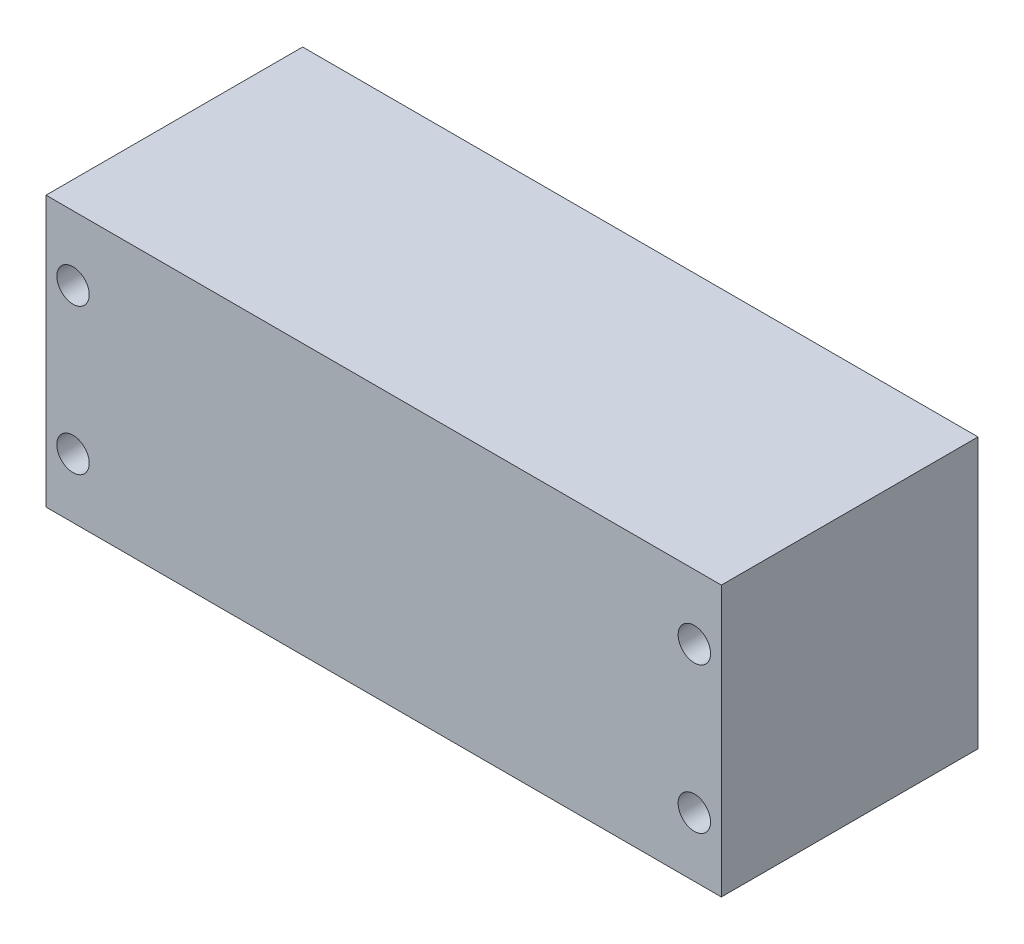
ISO-10303-21;
HEADER;
FILE_DESCRIPTION(('STEP AP214'),'2;1');
FILE_NAME('part.step','',(''),(''),'','','');
FILE_SCHEMA(('AUTOMOTIVE_DESIGN { 1 0 10303 214 1 1 1 1 }'));
ENDSEC;
DATA;
#1=APPLICATION_CONTEXT('core data for automotive mechanical design processes');
#2=APPLICATION_PROTOCOL_DEFINITION('international standard','automotive_design',2000,#1);
#3=PRODUCT_CONTEXT('',#1,'mechanical');
#4=PRODUCT('Part','Part','',(#3));
#5=PRODUCT_RELATED_PRODUCT_CATEGORY('part','',(#4));
#6=PRODUCT_DEFINITION_FORMATION('','',#4);
#7=PRODUCT_DEFINITION_CONTEXT('part definition',#1,'design');
#8=PRODUCT_DEFINITION('design','',#6,#7);
#9=PRODUCT_DEFINITION_SHAPE('','',#8);
#10=(LENGTH_UNIT() NAMED_UNIT(*) SI_UNIT(.MILLI.,.METRE.));
#11=(NAMED_UNIT(*) PLANE_ANGLE_UNIT() SI_UNIT($,.RADIAN.));
#12=(NAMED_UNIT(*) SI_UNIT($,.STERADIAN.) SOLID_ANGLE_UNIT());
#13=UNCERTAINTY_MEASURE_WITH_UNIT(LENGTH_MEASURE(1.E-05),#10,'distance_accuracy_value','');
#14=(GEOMETRIC_REPRESENTATION_CONTEXT(3) GLOBAL_UNCERTAINTY_ASSIGNED_CONTEXT((#13)) GLOBAL_UNIT_ASSIGNED_CONTEXT((#10,
#11,#12)) REPRESENTATION_CONTEXT('',''));
#15=CARTESIAN_POINT('',(0.,0.,0.));
#16=DIRECTION('',(0.,0.,1.));
#17=DIRECTION('',(1.,0.,0.));
#18=AXIS2_PLACEMENT_3D('',#15,#16,#17);
#19=CARTESIAN_POINT('',(-33.75,21.5625,38.));
#20=DIRECTION('',(1.,0.,0.));
#21=DIRECTION('',(0.,0.,-1.));
#22=AXIS2_PLACEMENT_3D('',#19,#20,#21);
#23=PLANE('',#22);
#24=DIRECTION('',(0.,-1.,0.));
#25=VECTOR('',#24,1.);
#26=CARTESIAN_POINT('',(-33.75,21.5625,0.));
#27=LINE('',#26,#25);
#28=CARTESIAN_POINT('',(-33.75,21.5625,0.));
#29=VERTEX_POINT('',#28);
#30=CARTESIAN_POINT('',(-33.75,-18.4375,0.));
#31=VERTEX_POINT('',#30);
#32=EDGE_CURVE('E226',#29,#31,#27,.T.);
#33=ORIENTED_EDGE('',*,*,#32,.T.);
#34=DIRECTION('',(0.,0.,-1.));
#35=VECTOR('',#34,1.);
#36=CARTESIAN_POINT('',(-33.75,-18.4375,38.));
#37=LINE('',#36,#35);
#38=CARTESIAN_POINT('',(-33.75,-18.4375,38.));
#39=VERTEX_POINT('',#38);
#40=EDGE_CURVE('E11',#39,#31,#37,.T.);
#41=ORIENTED_EDGE('',*,*,#40,.F.);
#42=DIRECTION('',(0.,-1.,0.));
#43=VECTOR('',#42,1.);
#44=CARTESIAN_POINT('',(-33.75,21.5625,38.));
#45=LINE('',#44,#43);
#46=CARTESIAN_POINT('',(-33.75,21.5625,38.));
#47=VERTEX_POINT('',#46);
#48=EDGE_CURVE('E262',#47,#39,#45,.T.);
#49=ORIENTED_EDGE('',*,*,#48,.F.);
#50=DIRECTION('',(0.,0.,-1.));
#51=VECTOR('',#50,1.);
#52=CARTESIAN_POINT('',(-33.75,21.5625,38.));
#53=LINE('',#52,#51);
#54=EDGE_CURVE('E268',#47,#29,#53,.T.);
#55=ORIENTED_EDGE('',*,*,#54,.T.);
#56=EDGE_LOOP('',(#33,#41,#49,#55));
#57=FACE_BOUND('',#56,.T.);
#58=ADVANCED_FACE('F35',(#57),#23,.F.);
#59=CARTESIAN_POINT('',(-33.75,-18.4375,38.));
#60=DIRECTION('',(0.,1.,0.));
#61=DIRECTION('',(0.,0.,1.));
#62=AXIS2_PLACEMENT_3D('',#59,#60,#61);
#63=PLANE('',#62);
#64=DIRECTION('',(1.,0.,0.));
#65=VECTOR('',#64,1.);
#66=CARTESIAN_POINT('',(-33.75,-18.4375,0.));
#67=LINE('',#66,#65);
#68=CARTESIAN_POINT('',(66.25,-18.4375,0.));
#69=VERTEX_POINT('',#68);
#70=EDGE_CURVE('E271',#31,#69,#67,.T.);
#71=ORIENTED_EDGE('',*,*,#70,.T.);
#72=DIRECTION('',(0.,0.,-1.));
#73=VECTOR('',#72,1.);
#74=CARTESIAN_POINT('',(66.25,-18.4375,38.));
#75=LINE('',#74,#73);
#76=CARTESIAN_POINT('',(66.25,-18.4375,38.));
#77=VERTEX_POINT('',#76);
#78=EDGE_CURVE('E42',#77,#69,#75,.T.);
#79=ORIENTED_EDGE('',*,*,#78,.F.);
#80=DIRECTION('',(1.,0.,0.));
#81=VECTOR('',#80,1.);
#82=CARTESIAN_POINT('',(-33.75,-18.4375,38.));
#83=LINE('',#82,#81);
#84=EDGE_CURVE('E86',#39,#77,#83,.T.);
#85=ORIENTED_EDGE('',*,*,#84,.F.);
#86=ORIENTED_EDGE('',*,*,#40,.T.);
#87=EDGE_LOOP('',(#71,#79,#85,#86));
#88=FACE_BOUND('',#87,.T.);
#89=ADVANCED_FACE('F301',(#88),#63,.F.);
#90=CARTESIAN_POINT('',(66.25,21.5625,38.));
#91=DIRECTION('',(-1.,0.,0.));
#92=DIRECTION('',(0.,0.,1.));
#93=AXIS2_PLACEMENT_3D('',#90,#91,#92);
#94=PLANE('',#93);
#95=DIRECTION('',(0.,1.,0.));
#96=VECTOR('',#95,1.);
#97=CARTESIAN_POINT('',(66.25,21.5625,0.));
#98=LINE('',#97,#96);
#99=CARTESIAN_POINT('',(66.25,21.5625,0.));
#100=VERTEX_POINT('',#99);
#101=EDGE_CURVE('E273',#69,#100,#98,.T.);
#102=ORIENTED_EDGE('',*,*,#101,.T.);
#103=DIRECTION('',(0.,0.,-1.));
#104=VECTOR('',#103,1.);
#105=CARTESIAN_POINT('',(66.25,21.5625,38.));
#106=LINE('',#105,#104);
#107=CARTESIAN_POINT('',(66.25,21.5625,38.));
#108=VERTEX_POINT('',#107);
#109=EDGE_CURVE('E277',#108,#100,#106,.T.);
#110=ORIENTED_EDGE('',*,*,#109,.F.);
#111=DIRECTION('',(0.,1.,0.));
#112=VECTOR('',#111,1.);
#113=CARTESIAN_POINT('',(66.25,21.5625,38.));
#114=LINE('',#113,#112);
#115=EDGE_CURVE('E265',#77,#108,#114,.T.);
#116=ORIENTED_EDGE('',*,*,#115,.F.);
#117=ORIENTED_EDGE('',*,*,#78,.T.);
#118=EDGE_LOOP('',(#102,#110,#116,#117));
#119=FACE_BOUND('',#118,.T.);
#120=ADVANCED_FACE('F282',(#119),#94,.F.);
#121=CARTESIAN_POINT('',(-33.75,21.5625,38.));
#122=DIRECTION('',(0.,-1.,0.));
#123=DIRECTION('',(0.,0.,-1.));
#124=AXIS2_PLACEMENT_3D('',#121,#122,#123);
#125=PLANE('',#124);
#126=DIRECTION('',(-1.,0.,0.));
#127=VECTOR('',#126,1.);
#128=CARTESIAN_POINT('',(-33.75,21.5625,0.));
#129=LINE('',#128,#127);
#130=EDGE_CURVE('E79',#100,#29,#129,.T.);
#131=ORIENTED_EDGE('',*,*,#130,.T.);
#132=ORIENTED_EDGE('',*,*,#54,.F.);
#133=DIRECTION('',(-1.,0.,0.));
#134=VECTOR('',#133,1.);
#135=CARTESIAN_POINT('',(-33.75,21.5625,38.));
#136=LINE('',#135,#134);
#137=EDGE_CURVE('E58',#108,#47,#136,.T.);
#138=ORIENTED_EDGE('',*,*,#137,.F.);
#139=ORIENTED_EDGE('',*,*,#109,.T.);
#140=EDGE_LOOP('',(#131,#132,#138,#139));
#141=FACE_BOUND('',#140,.T.);
#142=ADVANCED_FACE('F290',(#141),#125,.F.);
#143=CARTESIAN_POINT('',(0.,0.,38.));
#144=DIRECTION('',(0.,0.,1.));
#145=DIRECTION('',(1.,0.,0.));
#146=AXIS2_PLACEMENT_3D('',#143,#144,#145);
#147=PLANE('',#146);
#148=CARTESIAN_POINT('',(62.25,-9.61656175528777,38.));
#149=DIRECTION('',(0.,0.,1.));
#150=DIRECTION('',(1.,0.,0.));
#151=AXIS2_PLACEMENT_3D('',#148,#149,#150);
#152=CIRCLE('',#151,2.4);
#153=CARTESIAN_POINT('',(64.65,-9.61656175528777,38.));
#154=VERTEX_POINT('',#153);
#155=EDGE_CURVE('E541',#154,#154,#152,.F.);
#156=ORIENTED_EDGE('',*,*,#155,.T.);
#157=EDGE_LOOP('',(#156));
#158=FACE_BOUND('',#157,.T.);
#159=CARTESIAN_POINT('',(-29.75,11.9847981896726,38.));
#160=DIRECTION('',(0.,0.,1.));
#161=DIRECTION('',(1.,0.,0.));
#162=AXIS2_PLACEMENT_3D('',#159,#160,#161);
#163=CIRCLE('',#162,2.4);
#164=CARTESIAN_POINT('',(-27.35,11.9847981896726,38.));
#165=VERTEX_POINT('',#164);
#166=EDGE_CURVE('E555',#165,#165,#163,.F.);
#167=ORIENTED_EDGE('',*,*,#166,.T.);
#168=EDGE_LOOP('',(#167));
#169=FACE_BOUND('',#168,.T.);
#170=CARTESIAN_POINT('',(-29.75,-9.61656175528777,38.));
#171=DIRECTION('',(0.,0.,1.));
#172=DIRECTION('',(1.,0.,0.));
#173=AXIS2_PLACEMENT_3D('',#170,#171,#172);
#174=CIRCLE('',#173,2.4);
#175=CARTESIAN_POINT('',(-27.35,-9.61656175528777,38.));
#176=VERTEX_POINT('',#175);
#177=EDGE_CURVE('E550',#176,#176,#174,.F.);
#178=ORIENTED_EDGE('',*,*,#177,.T.);
#179=EDGE_LOOP('',(#178));
#180=FACE_BOUND('',#179,.T.);
#181=CARTESIAN_POINT('',(62.25,11.9847981896726,38.));
#182=DIRECTION('',(0.,0.,1.));
#183=DIRECTION('',(1.,0.,0.));
#184=AXIS2_PLACEMENT_3D('',#181,#182,#183);
#185=CIRCLE('',#184,2.4);
#186=CARTESIAN_POINT('',(64.65,11.9847981896726,38.));
#187=VERTEX_POINT('',#186);
#188=EDGE_CURVE('E181',#187,#187,#185,.F.);
#189=ORIENTED_EDGE('',*,*,#188,.T.);
#190=EDGE_LOOP('',(#189));
#191=FACE_BOUND('',#190,.T.);
#192=ORIENTED_EDGE('',*,*,#48,.T.);
#193=ORIENTED_EDGE('',*,*,#84,.T.);
#194=ORIENTED_EDGE('',*,*,#115,.T.);
#195=ORIENTED_EDGE('',*,*,#137,.T.);
#196=EDGE_LOOP('',(#192,#193,#194,#195));
#197=FACE_BOUND('',#196,.T.);
#198=ADVANCED_FACE('F292',(#158,#169,#180,#191,#197),#147,.T.);
#199=CARTESIAN_POINT('',(0.,0.,0.));
#200=DIRECTION('',(0.,0.,1.));
#201=DIRECTION('',(1.,0.,0.));
#202=AXIS2_PLACEMENT_3D('',#199,#200,#201);
#203=PLANE('',#202);
#204=CARTESIAN_POINT('',(62.25,-9.61656175528777,0.));
#205=DIRECTION('',(0.,0.,-1.));
#206=DIRECTION('',(-1.,0.,0.));
#207=AXIS2_PLACEMENT_3D('',#204,#205,#206);
#208=CIRCLE('',#207,2.4);
#209=CARTESIAN_POINT('',(59.85,-9.61656175528777,0.));
#210=VERTEX_POINT('',#209);
#211=EDGE_CURVE('E544',#210,#210,#208,.T.);
#212=ORIENTED_EDGE('',*,*,#211,.F.);
#213=EDGE_LOOP('',(#212));
#214=FACE_BOUND('',#213,.T.);
#215=CARTESIAN_POINT('',(-29.75,11.9847981896726,0.));
#216=DIRECTION('',(0.,0.,-1.));
#217=DIRECTION('',(-1.,0.,0.));
#218=AXIS2_PLACEMENT_3D('',#215,#216,#217);
#219=CIRCLE('',#218,2.4);
#220=CARTESIAN_POINT('',(-32.15,11.9847981896726,0.));
#221=VERTEX_POINT('',#220);
#222=EDGE_CURVE('E547',#221,#221,#219,.T.);
#223=ORIENTED_EDGE('',*,*,#222,.F.);
#224=EDGE_LOOP('',(#223));
#225=FACE_BOUND('',#224,.T.);
#226=CARTESIAN_POINT('',(-29.75,-9.61656175528777,0.));
#227=DIRECTION('',(0.,0.,-1.));
#228=DIRECTION('',(-1.,0.,0.));
#229=AXIS2_PLACEMENT_3D('',#226,#227,#228);
#230=CIRCLE('',#229,2.4);
#231=CARTESIAN_POINT('',(-32.15,-9.61656175528777,0.));
#232=VERTEX_POINT('',#231);
#233=EDGE_CURVE('E557',#232,#232,#230,.T.);
#234=ORIENTED_EDGE('',*,*,#233,.F.);
#235=EDGE_LOOP('',(#234));
#236=FACE_BOUND('',#235,.T.);
#237=CARTESIAN_POINT('',(62.25,11.9847981896726,0.));
#238=DIRECTION('',(0.,0.,-1.));
#239=DIRECTION('',(-1.,0.,0.));
#240=AXIS2_PLACEMENT_3D('',#237,#238,#239);
#241=CIRCLE('',#240,2.4);
#242=CARTESIAN_POINT('',(59.85,11.9847981896726,0.));
#243=VERTEX_POINT('',#242);
#244=EDGE_CURVE('E188',#243,#243,#241,.T.);
#245=ORIENTED_EDGE('',*,*,#244,.F.);
#246=EDGE_LOOP('',(#245));
#247=FACE_BOUND('',#246,.T.);
#248=CARTESIAN_POINT('',(14.7943646779699,41.4869776839567,0.));
#249=DIRECTION('',(0.,0.,-1.));
#250=DIRECTION('',(-1.,0.,0.));
#251=AXIS2_PLACEMENT_3D('',#248,#249,#250);
#252=CIRCLE('',#251,58.9624815007806);
#253=CARTESIAN_POINT('',(58.2310525399103,1.61432574914989,0.));
#254=VERTEX_POINT('',#253);
#255=CARTESIAN_POINT('',(-25.078287256837,-1.94971017798371,0.));
#256=VERTEX_POINT('',#255);
#257=EDGE_CURVE('E187',#254,#256,#252,.T.);
#258=ORIENTED_EDGE('',*,*,#257,.F.);
#259=CARTESIAN_POINT('',(52.2795275247732,7.07752050663463,0.));
#260=DIRECTION('',(0.,0.,-1.));
#261=DIRECTION('',(-1.,0.,0.));
#262=AXIS2_PLACEMENT_3D('',#259,#260,#261);
#263=CIRCLE('',#262,8.07880851140879);
#264=CARTESIAN_POINT('',(46.3280025096362,12.5407152641194,0.));
#265=VERTEX_POINT('',#264);
#266=EDGE_CURVE('E49',#265,#254,#263,.T.);
#267=ORIENTED_EDGE('',*,*,#266,.F.);
#268=CARTESIAN_POINT('',(14.7943646779699,41.4869776839567,0.));
#269=DIRECTION('',(0.,0.,-1.));
#270=DIRECTION('',(-1.,0.,0.));
#271=AXIS2_PLACEMENT_3D('',#268,#269,#270);
#272=CIRCLE('',#271,42.804864477963);
#273=CARTESIAN_POINT('',(-14.1518977418674,9.95333985229037,0.));
#274=VERTEX_POINT('',#273);
#275=EDGE_CURVE('E175',#265,#274,#272,.T.);
#276=ORIENTED_EDGE('',*,*,#275,.T.);
#277=CARTESIAN_POINT('',(-19.6150924993522,4.00181483715333,0.));
#278=DIRECTION('',(0.,0.,-1.));
#279=DIRECTION('',(-1.,0.,0.));
#280=AXIS2_PLACEMENT_3D('',#277,#278,#279);
#281=CIRCLE('',#280,8.07880851140879);
#282=EDGE_CURVE('E178',#256,#274,#281,.T.);
#283=ORIENTED_EDGE('',*,*,#282,.F.);
#284=EDGE_LOOP('',(#258,#267,#276,#283));
#285=FACE_BOUND('',#284,.T.);
#286=ORIENTED_EDGE('',*,*,#32,.F.);
#287=ORIENTED_EDGE('',*,*,#130,.F.);
#288=ORIENTED_EDGE('',*,*,#101,.F.);
#289=ORIENTED_EDGE('',*,*,#70,.F.);
#290=EDGE_LOOP('',(#286,#287,#288,#289));
#291=FACE_BOUND('',#290,.T.);
#292=ADVANCED_FACE('F286',(#214,#225,#236,#247,#285,#291),#203,.F.);
#293=CARTESIAN_POINT('',(52.2795275247732,7.07752050663463,9.));
#294=DIRECTION('',(0.,0.,-1.));
#295=DIRECTION('',(-1.,0.,0.));
#296=AXIS2_PLACEMENT_3D('',#293,#294,#295);
#297=CYLINDRICAL_SURFACE('',#296,8.07880851140879);
#298=ORIENTED_EDGE('',*,*,#266,.T.);
#299=DIRECTION('',(0.,0.,-1.));
#300=VECTOR('',#299,1.);
#301=CARTESIAN_POINT('',(58.2310525399103,1.61432574914989,9.));
#302=LINE('',#301,#300);
#303=CARTESIAN_POINT('',(58.2310525399103,1.61432574914989,9.));
#304=VERTEX_POINT('',#303);
#305=EDGE_CURVE('E154',#304,#254,#302,.T.);
#306=ORIENTED_EDGE('',*,*,#305,.F.);
#307=CARTESIAN_POINT('',(52.2795275247732,7.07752050663463,9.));
#308=DIRECTION('',(0.,0.,-1.));
#309=DIRECTION('',(-1.,0.,0.));
#310=AXIS2_PLACEMENT_3D('',#307,#308,#309);
#311=CIRCLE('',#310,8.07880851140879);
#312=CARTESIAN_POINT('',(46.3280025096362,12.5407152641194,9.));
#313=VERTEX_POINT('',#312);
#314=EDGE_CURVE('E158',#313,#304,#311,.T.);
#315=ORIENTED_EDGE('',*,*,#314,.F.);
#316=DIRECTION('',(0.,0.,-1.));
#317=VECTOR('',#316,1.);
#318=CARTESIAN_POINT('',(46.3280025096362,12.5407152641194,9.));
#319=LINE('',#318,#317);
#320=EDGE_CURVE('E192',#313,#265,#319,.T.);
#321=ORIENTED_EDGE('',*,*,#320,.T.);
#322=EDGE_LOOP('',(#298,#306,#315,#321));
#323=FACE_BOUND('',#322,.T.);
#324=ADVANCED_FACE('F156',(#323),#297,.F.);
#325=CARTESIAN_POINT('',(14.7943646779699,41.4869776839567,9.));
#326=DIRECTION('',(0.,0.,-1.));
#327=DIRECTION('',(-1.,0.,0.));
#328=AXIS2_PLACEMENT_3D('',#325,#326,#327);
#329=CYLINDRICAL_SURFACE('',#328,42.804864477963);
#330=ORIENTED_EDGE('',*,*,#275,.F.);
#331=ORIENTED_EDGE('',*,*,#320,.F.);
#332=CARTESIAN_POINT('',(14.7943646779699,41.4869776839567,9.));
#333=DIRECTION('',(0.,0.,-1.));
#334=DIRECTION('',(-1.,0.,0.));
#335=AXIS2_PLACEMENT_3D('',#332,#333,#334);
#336=CIRCLE('',#335,42.804864477963);
#337=CARTESIAN_POINT('',(-14.1518977418674,9.95333985229037,9.));
#338=VERTEX_POINT('',#337);
#339=EDGE_CURVE('E163',#313,#338,#336,.T.);
#340=ORIENTED_EDGE('',*,*,#339,.T.);
#341=DIRECTION('',(0.,0.,-1.));
#342=VECTOR('',#341,1.);
#343=CARTESIAN_POINT('',(-14.1518977418674,9.95333985229037,9.));
#344=LINE('',#343,#342);
#345=EDGE_CURVE('E195',#338,#274,#344,.T.);
#346=ORIENTED_EDGE('',*,*,#345,.T.);
#347=EDGE_LOOP('',(#330,#331,#340,#346));
#348=FACE_BOUND('',#347,.T.);
#349=ADVANCED_FACE('F454',(#348),#329,.T.);
#350=CARTESIAN_POINT('',(-19.6150924993522,4.00181483715333,9.));
#351=DIRECTION('',(0.,0.,-1.));
#352=DIRECTION('',(-1.,0.,0.));
#353=AXIS2_PLACEMENT_3D('',#350,#351,#352);
#354=CYLINDRICAL_SURFACE('',#353,8.07880851140879);
#355=ORIENTED_EDGE('',*,*,#282,.T.);
#356=ORIENTED_EDGE('',*,*,#345,.F.);
#357=CARTESIAN_POINT('',(-19.6150924993522,4.00181483715333,9.));
#358=DIRECTION('',(0.,0.,-1.));
#359=DIRECTION('',(-1.,0.,0.));
#360=AXIS2_PLACEMENT_3D('',#357,#358,#359);
#361=CIRCLE('',#360,8.07880851140879);
#362=CARTESIAN_POINT('',(-25.078287256837,-1.94971017798371,9.));
#363=VERTEX_POINT('',#362);
#364=EDGE_CURVE('E171',#363,#338,#361,.T.);
#365=ORIENTED_EDGE('',*,*,#364,.F.);
#366=DIRECTION('',(0.,0.,-1.));
#367=VECTOR('',#366,1.);
#368=CARTESIAN_POINT('',(-25.078287256837,-1.94971017798371,9.));
#369=LINE('',#368,#367);
#370=EDGE_CURVE('E162',#363,#256,#369,.T.);
#371=ORIENTED_EDGE('',*,*,#370,.T.);
#372=EDGE_LOOP('',(#355,#356,#365,#371));
#373=FACE_BOUND('',#372,.T.);
#374=ADVANCED_FACE('F464',(#373),#354,.F.);
#375=CARTESIAN_POINT('',(14.7943646779699,41.4869776839567,9.));
#376=DIRECTION('',(0.,0.,-1.));
#377=DIRECTION('',(-1.,0.,0.));
#378=AXIS2_PLACEMENT_3D('',#375,#376,#377);
#379=CYLINDRICAL_SURFACE('',#378,58.9624815007806);
#380=ORIENTED_EDGE('',*,*,#257,.T.);
#381=ORIENTED_EDGE('',*,*,#370,.F.);
#382=CARTESIAN_POINT('',(14.7943646779699,41.4869776839567,9.));
#383=DIRECTION('',(0.,0.,-1.));
#384=DIRECTION('',(-1.,0.,0.));
#385=AXIS2_PLACEMENT_3D('',#382,#383,#384);
#386=CIRCLE('',#385,58.9624815007806);
#387=EDGE_CURVE('E166',#304,#363,#386,.T.);
#388=ORIENTED_EDGE('',*,*,#387,.F.);
#389=ORIENTED_EDGE('',*,*,#305,.T.);
#390=EDGE_LOOP('',(#380,#381,#388,#389));
#391=FACE_BOUND('',#390,.T.);
#392=ADVANCED_FACE('F167',(#391),#379,.F.);
#393=CARTESIAN_POINT('',(33.5369461013716,24.2822490952957,9.));
#394=DIRECTION('',(0.,0.,-1.));
#395=DIRECTION('',(-1.,0.,0.));
#396=AXIS2_PLACEMENT_3D('',#393,#394,#395);
#397=PLANE('',#396);
#398=ORIENTED_EDGE('',*,*,#314,.T.);
#399=ORIENTED_EDGE('',*,*,#387,.T.);
#400=ORIENTED_EDGE('',*,*,#364,.T.);
#401=ORIENTED_EDGE('',*,*,#339,.F.);
#402=EDGE_LOOP('',(#398,#399,#400,#401));
#403=FACE_BOUND('',#402,.T.);
#404=ADVANCED_FACE('F174',(#403),#397,.T.);
#405=CARTESIAN_POINT('',(62.25,11.9847981896726,38.001));
#406=DIRECTION('',(0.,0.,-1.));
#407=DIRECTION('',(-1.,0.,0.));
#408=AXIS2_PLACEMENT_3D('',#405,#406,#407);
#409=CYLINDRICAL_SURFACE('',#408,2.4);
#410=ORIENTED_EDGE('',*,*,#188,.F.);
#411=EDGE_LOOP('',(#410));
#412=FACE_BOUND('',#411,.T.);
#413=ORIENTED_EDGE('',*,*,#244,.T.);
#414=EDGE_LOOP('',(#413));
#415=FACE_BOUND('',#414,.T.);
#416=ADVANCED_FACE('F489',(#412,#415),#409,.F.);
#417=CARTESIAN_POINT('',(-29.75,-9.61656175528777,38.001));
#418=DIRECTION('',(0.,0.,-1.));
#419=DIRECTION('',(-1.,0.,0.));
#420=AXIS2_PLACEMENT_3D('',#417,#418,#419);
#421=CYLINDRICAL_SURFACE('',#420,2.4);
#422=ORIENTED_EDGE('',*,*,#177,.F.);
#423=EDGE_LOOP('',(#422));
#424=FACE_BOUND('',#423,.T.);
#425=ORIENTED_EDGE('',*,*,#233,.T.);
#426=EDGE_LOOP('',(#425));
#427=FACE_BOUND('',#426,.T.);
#428=ADVANCED_FACE('F504',(#424,#427),#421,.F.);
#429=CARTESIAN_POINT('',(-29.75,11.9847981896726,38.001));
#430=DIRECTION('',(0.,0.,-1.));
#431=DIRECTION('',(-1.,0.,0.));
#432=AXIS2_PLACEMENT_3D('',#429,#430,#431);
#433=CYLINDRICAL_SURFACE('',#432,2.4);
#434=ORIENTED_EDGE('',*,*,#166,.F.);
#435=EDGE_LOOP('',(#434));
#436=FACE_BOUND('',#435,.T.);
#437=ORIENTED_EDGE('',*,*,#222,.T.);
#438=EDGE_LOOP('',(#437));
#439=FACE_BOUND('',#438,.T.);
#440=ADVANCED_FACE('F514',(#436,#439),#433,.F.);
#441=CARTESIAN_POINT('',(62.25,-9.61656175528777,38.001));
#442=DIRECTION('',(0.,0.,-1.));
#443=DIRECTION('',(-1.,0.,0.));
#444=AXIS2_PLACEMENT_3D('',#441,#442,#443);
#445=CYLINDRICAL_SURFACE('',#444,2.4);
#446=ORIENTED_EDGE('',*,*,#155,.F.);
#447=EDGE_LOOP('',(#446));
#448=FACE_BOUND('',#447,.T.);
#449=ORIENTED_EDGE('',*,*,#211,.T.);
#450=EDGE_LOOP('',(#449));
#451=FACE_BOUND('',#450,.T.);
#452=ADVANCED_FACE('F524',(#448,#451),#445,.F.);
#453=CLOSED_SHELL('',(#58,#89,#120,#142,#198,#292,#324,#349,#374,#392,#404,#416,#428,#440,#452));
#454=CARTESIAN_POINT('',(58.25,18.5625,33.));
#455=DIRECTION('',(1.,0.,0.));
#456=DIRECTION('',(0.,1.,0.));
#457=AXIS2_PLACEMENT_3D('',#454,#455,#456);
#458=PLANE('',#457);
#459=DIRECTION('',(0.,-1.,0.));
#460=VECTOR('',#459,1.);
#461=CARTESIAN_POINT('',(58.25,18.5625,12.));
#462=LINE('',#461,#460);
#463=CARTESIAN_POINT('',(58.25,18.5625,12.));
#464=VERTEX_POINT('',#463);
#465=CARTESIAN_POINT('',(58.25,-15.4375,12.));
#466=VERTEX_POINT('',#465);
#467=EDGE_CURVE('E212',#464,#466,#462,.T.);
#468=ORIENTED_EDGE('',*,*,#467,.T.);
#469=DIRECTION('',(0.,0.,-1.));
#470=VECTOR('',#469,1.);
#471=CARTESIAN_POINT('',(58.25,-15.4375,33.));
#472=LINE('',#471,#470);
#473=CARTESIAN_POINT('',(58.25,-15.4375,33.));
#474=VERTEX_POINT('',#473);
#475=EDGE_CURVE('E211',#474,#466,#472,.T.);
#476=ORIENTED_EDGE('',*,*,#475,.F.);
#477=DIRECTION('',(0.,-1.,0.));
#478=VECTOR('',#477,1.);
#479=CARTESIAN_POINT('',(58.25,18.5625,33.));
#480=LINE('',#479,#478);
#481=CARTESIAN_POINT('',(58.25,18.5625,33.));
#482=VERTEX_POINT('',#481);
#483=EDGE_CURVE('E198',#482,#474,#480,.T.);
#484=ORIENTED_EDGE('',*,*,#483,.F.);
#485=DIRECTION('',(0.,0.,-1.));
#486=VECTOR('',#485,1.);
#487=CARTESIAN_POINT('',(58.25,18.5625,33.));
#488=LINE('',#487,#486);
#489=EDGE_CURVE('E224',#482,#464,#488,.T.);
#490=ORIENTED_EDGE('',*,*,#489,.T.);
#491=EDGE_LOOP('',(#468,#476,#484,#490));
#492=FACE_BOUND('',#491,.T.);
#493=ADVANCED_FACE('F324',(#492),#458,.F.);
#494=CARTESIAN_POINT('',(58.25,18.5625,33.));
#495=DIRECTION('',(0.,1.,0.));
#496=DIRECTION('',(0.,0.,1.));
#497=AXIS2_PLACEMENT_3D('',#494,#495,#496);
#498=PLANE('',#497);
#499=DIRECTION('',(1.,0.,0.));
#500=VECTOR('',#499,1.);
#501=CARTESIAN_POINT('',(58.25,18.5625,12.));
#502=LINE('',#501,#500);
#503=CARTESIAN_POINT('',(18.75,18.5625,12.));
#504=VERTEX_POINT('',#503);
#505=EDGE_CURVE('E202',#504,#464,#502,.T.);
#506=ORIENTED_EDGE('',*,*,#505,.T.);
#507=ORIENTED_EDGE('',*,*,#489,.F.);
#508=DIRECTION('',(1.,0.,0.));
#509=VECTOR('',#508,1.);
#510=CARTESIAN_POINT('',(58.25,18.5625,33.));
#511=LINE('',#510,#509);
#512=CARTESIAN_POINT('',(18.75,18.5625,33.));
#513=VERTEX_POINT('',#512);
#514=EDGE_CURVE('E208',#513,#482,#511,.T.);
#515=ORIENTED_EDGE('',*,*,#514,.F.);
#516=DIRECTION('',(0.,0.,-1.));
#517=VECTOR('',#516,1.);
#518=CARTESIAN_POINT('',(18.75,18.5625,33.));
#519=LINE('',#518,#517);
#520=EDGE_CURVE('E227',#513,#504,#519,.T.);
#521=ORIENTED_EDGE('',*,*,#520,.T.);
#522=EDGE_LOOP('',(#506,#507,#515,#521));
#523=FACE_BOUND('',#522,.T.);
#524=ADVANCED_FACE('F329',(#523),#498,.F.);
#525=CARTESIAN_POINT('',(18.75,18.5625,33.));
#526=DIRECTION('',(-1.,0.,0.));
#527=DIRECTION('',(0.,-1.,0.));
#528=AXIS2_PLACEMENT_3D('',#525,#526,#527);
#529=PLANE('',#528);
#530=DIRECTION('',(0.,1.,0.));
#531=VECTOR('',#530,1.);
#532=CARTESIAN_POINT('',(18.75,18.5625,12.));
#533=LINE('',#532,#531);
#534=CARTESIAN_POINT('',(18.75,-15.4375,12.));
#535=VERTEX_POINT('',#534);
#536=EDGE_CURVE('E219',#535,#504,#533,.T.);
#537=ORIENTED_EDGE('',*,*,#536,.T.);
#538=ORIENTED_EDGE('',*,*,#520,.F.);
#539=DIRECTION('',(0.,1.,0.));
#540=VECTOR('',#539,1.);
#541=CARTESIAN_POINT('',(18.75,18.5625,33.));
#542=LINE('',#541,#540);
#543=CARTESIAN_POINT('',(18.75,-15.4375,33.));
#544=VERTEX_POINT('',#543);
#545=EDGE_CURVE('E205',#544,#513,#542,.T.);
#546=ORIENTED_EDGE('',*,*,#545,.F.);
#547=DIRECTION('',(0.,0.,-1.));
#548=VECTOR('',#547,1.);
#549=CARTESIAN_POINT('',(18.75,-15.4375,33.));
#550=LINE('',#549,#548);
#551=EDGE_CURVE('E229',#544,#535,#550,.T.);
#552=ORIENTED_EDGE('',*,*,#551,.T.);
#553=EDGE_LOOP('',(#537,#538,#546,#552));
#554=FACE_BOUND('',#553,.T.);
#555=ADVANCED_FACE('F342',(#554),#529,.F.);
#556=CARTESIAN_POINT('',(58.25,-15.4375,33.));
#557=DIRECTION('',(0.,-1.,0.));
#558=DIRECTION('',(0.,0.,-1.));
#559=AXIS2_PLACEMENT_3D('',#556,#557,#558);
#560=PLANE('',#559);
#561=DIRECTION('',(-1.,0.,0.));
#562=VECTOR('',#561,1.);
#563=CARTESIAN_POINT('',(58.25,-15.4375,12.));
#564=LINE('',#563,#562);
#565=EDGE_CURVE('E215',#466,#535,#564,.T.);
#566=ORIENTED_EDGE('',*,*,#565,.T.);
#567=ORIENTED_EDGE('',*,*,#551,.F.);
#568=DIRECTION('',(-1.,0.,0.));
#569=VECTOR('',#568,1.);
#570=CARTESIAN_POINT('',(58.25,-15.4375,33.));
#571=LINE('',#570,#569);
#572=EDGE_CURVE('E201',#474,#544,#571,.T.);
#573=ORIENTED_EDGE('',*,*,#572,.F.);
#574=ORIENTED_EDGE('',*,*,#475,.T.);
#575=EDGE_LOOP('',(#566,#567,#573,#574));
#576=FACE_BOUND('',#575,.T.);
#577=ADVANCED_FACE('F352',(#576),#560,.F.);
#578=CARTESIAN_POINT('',(0.,0.,33.));
#579=DIRECTION('',(0.,0.,-1.));
#580=DIRECTION('',(-1.,0.,0.));
#581=AXIS2_PLACEMENT_3D('',#578,#579,#580);
#582=PLANE('',#581);
#583=ORIENTED_EDGE('',*,*,#483,.T.);
#584=ORIENTED_EDGE('',*,*,#572,.T.);
#585=ORIENTED_EDGE('',*,*,#545,.T.);
#586=ORIENTED_EDGE('',*,*,#514,.T.);
#587=EDGE_LOOP('',(#583,#584,#585,#586));
#588=FACE_BOUND('',#587,.T.);
#589=ADVANCED_FACE('F362',(#588),#582,.T.);
#590=CARTESIAN_POINT('',(0.,0.,12.));
#591=DIRECTION('',(0.,0.,-1.));
#592=DIRECTION('',(-1.,0.,0.));
#593=AXIS2_PLACEMENT_3D('',#590,#591,#592);
#594=PLANE('',#593);
#595=ORIENTED_EDGE('',*,*,#467,.F.);
#596=ORIENTED_EDGE('',*,*,#505,.F.);
#597=ORIENTED_EDGE('',*,*,#536,.F.);
#598=ORIENTED_EDGE('',*,*,#565,.F.);
#599=EDGE_LOOP('',(#595,#596,#597,#598));
#600=FACE_BOUND('',#599,.T.);
#601=ADVANCED_FACE('F372',(#600),#594,.F.);
#602=CLOSED_SHELL('',(#493,#524,#555,#577,#589,#601));
#603=CARTESIAN_POINT('',(13.75,18.5625,33.));
#604=DIRECTION('',(1.,0.,0.));
#605=DIRECTION('',(0.,1.,0.));
#606=AXIS2_PLACEMENT_3D('',#603,#604,#605);
#607=PLANE('',#606);
#608=DIRECTION('',(0.,-1.,0.));
#609=VECTOR('',#608,1.);
#610=CARTESIAN_POINT('',(13.75,18.5625,12.));
#611=LINE('',#610,#609);
#612=CARTESIAN_POINT('',(13.75,18.5625,12.));
#613=VERTEX_POINT('',#612);
#614=CARTESIAN_POINT('',(13.75,-15.4375,12.));
#615=VERTEX_POINT('',#614);
#616=EDGE_CURVE('E194',#613,#615,#611,.T.);
#617=ORIENTED_EDGE('',*,*,#616,.T.);
#618=DIRECTION('',(0.,0.,-1.));
#619=VECTOR('',#618,1.);
#620=CARTESIAN_POINT('',(13.75,-15.4375,33.));
#621=LINE('',#620,#619);
#622=CARTESIAN_POINT('',(13.75,-15.4375,33.));
#623=VERTEX_POINT('',#622);
#624=EDGE_CURVE('E245',#623,#615,#621,.T.);
#625=ORIENTED_EDGE('',*,*,#624,.F.);
#626=DIRECTION('',(0.,-1.,0.));
#627=VECTOR('',#626,1.);
#628=CARTESIAN_POINT('',(13.75,18.5625,33.));
#629=LINE('',#628,#627);
#630=CARTESIAN_POINT('',(13.75,18.5625,33.));
#631=VERTEX_POINT('',#630);
#632=EDGE_CURVE('E232',#631,#623,#629,.T.);
#633=ORIENTED_EDGE('',*,*,#632,.F.);
#634=DIRECTION('',(0.,0.,-1.));
#635=VECTOR('',#634,1.);
#636=CARTESIAN_POINT('',(13.75,18.5625,33.));
#637=LINE('',#636,#635);
#638=EDGE_CURVE('E216',#631,#613,#637,.T.);
#639=ORIENTED_EDGE('',*,*,#638,.T.);
#640=EDGE_LOOP('',(#617,#625,#633,#639));
#641=FACE_BOUND('',#640,.T.);
#642=ADVANCED_FACE('F389',(#641),#607,.F.);
#643=CARTESIAN_POINT('',(13.75,18.5625,33.));
#644=DIRECTION('',(0.,1.,0.));
#645=DIRECTION('',(0.,0.,1.));
#646=AXIS2_PLACEMENT_3D('',#643,#644,#645);
#647=PLANE('',#646);
#648=DIRECTION('',(1.,0.,0.));
#649=VECTOR('',#648,1.);
#650=CARTESIAN_POINT('',(13.75,18.5625,12.));
#651=LINE('',#650,#649);
#652=CARTESIAN_POINT('',(-25.75,18.5625,12.));
#653=VERTEX_POINT('',#652);
#654=EDGE_CURVE('E236',#653,#613,#651,.T.);
#655=ORIENTED_EDGE('',*,*,#654,.T.);
#656=ORIENTED_EDGE('',*,*,#638,.F.);
#657=DIRECTION('',(1.,0.,0.));
#658=VECTOR('',#657,1.);
#659=CARTESIAN_POINT('',(13.75,18.5625,33.));
#660=LINE('',#659,#658);
#661=CARTESIAN_POINT('',(-25.75,18.5625,33.));
#662=VERTEX_POINT('',#661);
#663=EDGE_CURVE('E242',#662,#631,#660,.T.);
#664=ORIENTED_EDGE('',*,*,#663,.F.);
#665=DIRECTION('',(0.,0.,-1.));
#666=VECTOR('',#665,1.);
#667=CARTESIAN_POINT('',(-25.75,18.5625,33.));
#668=LINE('',#667,#666);
#669=EDGE_CURVE('E257',#662,#653,#668,.T.);
#670=ORIENTED_EDGE('',*,*,#669,.T.);
#671=EDGE_LOOP('',(#655,#656,#664,#670));
#672=FACE_BOUND('',#671,.T.);
#673=ADVANCED_FACE('F392',(#672),#647,.F.);
#674=CARTESIAN_POINT('',(-25.75,18.5625,33.));
#675=DIRECTION('',(-1.,0.,0.));
#676=DIRECTION('',(0.,-1.,0.));
#677=AXIS2_PLACEMENT_3D('',#674,#675,#676);
#678=PLANE('',#677);
#679=DIRECTION('',(0.,1.,0.));
#680=VECTOR('',#679,1.);
#681=CARTESIAN_POINT('',(-25.75,18.5625,12.));
#682=LINE('',#681,#680);
#683=CARTESIAN_POINT('',(-25.75,-15.4375,12.));
#684=VERTEX_POINT('',#683);
#685=EDGE_CURVE('E251',#684,#653,#682,.T.);
#686=ORIENTED_EDGE('',*,*,#685,.T.);
#687=ORIENTED_EDGE('',*,*,#669,.F.);
#688=DIRECTION('',(0.,1.,0.));
#689=VECTOR('',#688,1.);
#690=CARTESIAN_POINT('',(-25.75,18.5625,33.));
#691=LINE('',#690,#689);
#692=CARTESIAN_POINT('',(-25.75,-15.4375,33.));
#693=VERTEX_POINT('',#692);
#694=EDGE_CURVE('E239',#693,#662,#691,.T.);
#695=ORIENTED_EDGE('',*,*,#694,.F.);
#696=DIRECTION('',(0.,0.,-1.));
#697=VECTOR('',#696,1.);
#698=CARTESIAN_POINT('',(-25.75,-15.4375,33.));
#699=LINE('',#698,#697);
#700=EDGE_CURVE('E259',#693,#684,#699,.T.);
#701=ORIENTED_EDGE('',*,*,#700,.T.);
#702=EDGE_LOOP('',(#686,#687,#695,#701));
#703=FACE_BOUND('',#702,.T.);
#704=ADVANCED_FACE('F404',(#703),#678,.F.);
#705=CARTESIAN_POINT('',(13.75,-15.4375,33.));
#706=DIRECTION('',(0.,-1.,0.));
#707=DIRECTION('',(0.,0.,-1.));
#708=AXIS2_PLACEMENT_3D('',#705,#706,#707);
#709=PLANE('',#708);
#710=DIRECTION('',(-1.,0.,0.));
#711=VECTOR('',#710,1.);
#712=CARTESIAN_POINT('',(13.75,-15.4375,12.));
#713=LINE('',#712,#711);
#714=EDGE_CURVE('E248',#615,#684,#713,.T.);
#715=ORIENTED_EDGE('',*,*,#714,.T.);
#716=ORIENTED_EDGE('',*,*,#700,.F.);
#717=DIRECTION('',(-1.,0.,0.));
#718=VECTOR('',#717,1.);
#719=CARTESIAN_POINT('',(13.75,-15.4375,33.));
#720=LINE('',#719,#718);
#721=EDGE_CURVE('E235',#623,#693,#720,.T.);
#722=ORIENTED_EDGE('',*,*,#721,.F.);
#723=ORIENTED_EDGE('',*,*,#624,.T.);
#724=EDGE_LOOP('',(#715,#716,#722,#723));
#725=FACE_BOUND('',#724,.T.);
#726=ADVANCED_FACE('F414',(#725),#709,.F.);
#727=CARTESIAN_POINT('',(0.,0.,33.));
#728=DIRECTION('',(0.,0.,-1.));
#729=DIRECTION('',(-1.,0.,0.));
#730=AXIS2_PLACEMENT_3D('',#727,#728,#729);
#731=PLANE('',#730);
#732=ORIENTED_EDGE('',*,*,#632,.T.);
#733=ORIENTED_EDGE('',*,*,#721,.T.);
#734=ORIENTED_EDGE('',*,*,#694,.T.);
#735=ORIENTED_EDGE('',*,*,#663,.T.);
#736=EDGE_LOOP('',(#732,#733,#734,#735));
#737=FACE_BOUND('',#736,.T.);
#738=ADVANCED_FACE('F424',(#737),#731,.T.);
#739=CARTESIAN_POINT('',(0.,0.,12.));
#740=DIRECTION('',(0.,0.,-1.));
#741=DIRECTION('',(-1.,0.,0.));
#742=AXIS2_PLACEMENT_3D('',#739,#740,#741);
#743=PLANE('',#742);
#744=ORIENTED_EDGE('',*,*,#616,.F.);
#745=ORIENTED_EDGE('',*,*,#654,.F.);
#746=ORIENTED_EDGE('',*,*,#685,.F.);
#747=ORIENTED_EDGE('',*,*,#714,.F.);
#748=EDGE_LOOP('',(#744,#745,#746,#747));
#749=FACE_BOUND('',#748,.T.);
#750=ADVANCED_FACE('F434',(#749),#743,.F.);
#751=CLOSED_SHELL('',(#642,#673,#704,#726,#738,#750));
#752=ORIENTED_CLOSED_SHELL('',*,#602,.T.);
#753=ORIENTED_CLOSED_SHELL('',*,#751,.T.);
#754=BREP_WITH_VOIDS('B2',#453,(#752,#753));
#755=ADVANCED_BREP_SHAPE_REPRESENTATION('',(#18,#754),#14);
#756=SHAPE_DEFINITION_REPRESENTATION(#9,#755);
ENDSEC;
END-ISO-10303-21;
